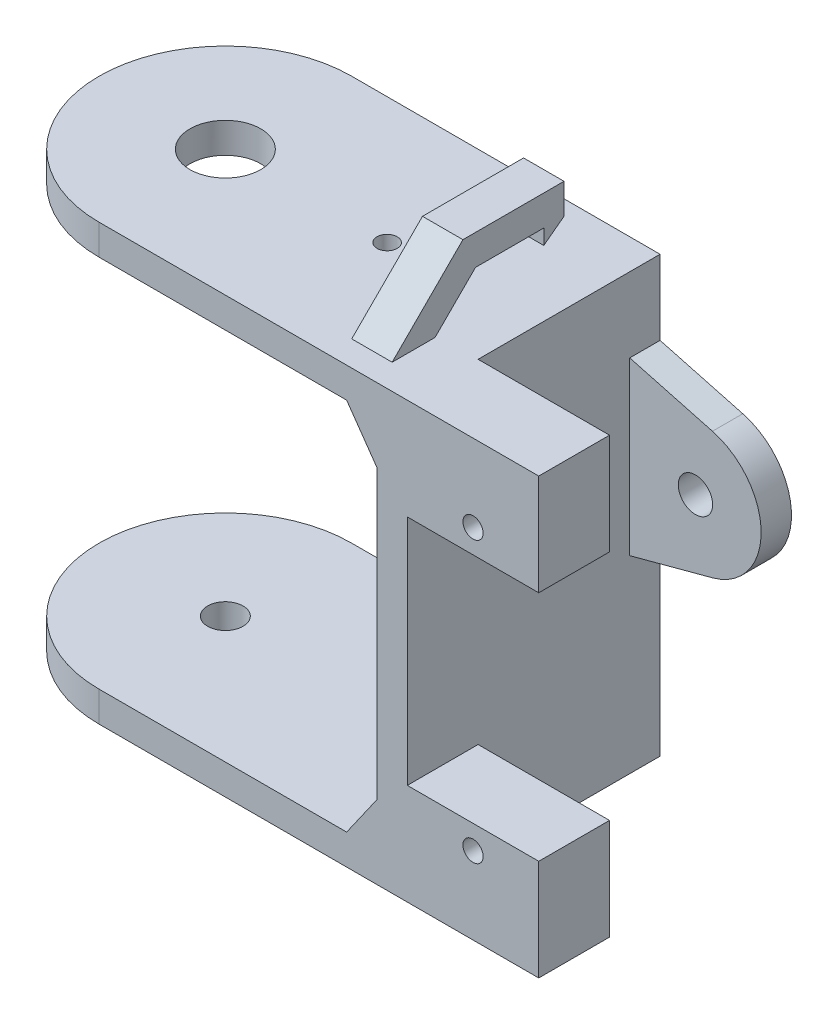
ISO-10303-21;
HEADER;
FILE_DESCRIPTION(('STEP AP214'),'2;1');
FILE_NAME('part.step','',(''),(''),'','','');
FILE_SCHEMA(('AUTOMOTIVE_DESIGN { 1 0 10303 214 1 1 1 1 }'));
ENDSEC;
DATA;
#1=APPLICATION_CONTEXT('core data for automotive mechanical design processes');
#2=APPLICATION_PROTOCOL_DEFINITION('international standard','automotive_design',2000,#1);
#3=PRODUCT_CONTEXT('',#1,'mechanical');
#4=PRODUCT('Part','Part','',(#3));
#5=PRODUCT_RELATED_PRODUCT_CATEGORY('part','',(#4));
#6=PRODUCT_DEFINITION_FORMATION('','',#4);
#7=PRODUCT_DEFINITION_CONTEXT('part definition',#1,'design');
#8=PRODUCT_DEFINITION('design','',#6,#7);
#9=PRODUCT_DEFINITION_SHAPE('','',#8);
#10=(LENGTH_UNIT() NAMED_UNIT(*) SI_UNIT(.MILLI.,.METRE.));
#11=(NAMED_UNIT(*) PLANE_ANGLE_UNIT() SI_UNIT($,.RADIAN.));
#12=(NAMED_UNIT(*) SI_UNIT($,.STERADIAN.) SOLID_ANGLE_UNIT());
#13=UNCERTAINTY_MEASURE_WITH_UNIT(LENGTH_MEASURE(1.E-05),#10,'distance_accuracy_value','');
#14=(GEOMETRIC_REPRESENTATION_CONTEXT(3) GLOBAL_UNCERTAINTY_ASSIGNED_CONTEXT((#13)) GLOBAL_UNIT_ASSIGNED_CONTEXT((#10,
#11,#12)) REPRESENTATION_CONTEXT('',''));
#15=CARTESIAN_POINT('',(0.,0.,0.));
#16=DIRECTION('',(0.,0.,1.));
#17=DIRECTION('',(1.,0.,0.));
#18=AXIS2_PLACEMENT_3D('',#15,#16,#17);
#19=CARTESIAN_POINT('',(-43.,21.5,12.5));
#20=DIRECTION('',(0.,-1.,0.));
#21=DIRECTION('',(1.,0.,0.));
#22=AXIS2_PLACEMENT_3D('',#19,#20,#21);
#23=PLANE('',#22);
#24=DIRECTION('',(0.,0.,-1.));
#25=VECTOR('',#24,1.);
#26=CARTESIAN_POINT('',(13.,21.5,12.5));
#27=LINE('',#26,#25);
#28=CARTESIAN_POINT('',(13.,21.5,12.5));
#29=VERTEX_POINT('',#28);
#30=CARTESIAN_POINT('',(13.,21.5,5.5));
#31=VERTEX_POINT('',#30);
#32=EDGE_CURVE('E418',#29,#31,#27,.T.);
#33=ORIENTED_EDGE('',*,*,#32,.T.);
#34=DIRECTION('',(1.,0.,0.));
#35=VECTOR('',#34,1.);
#36=CARTESIAN_POINT('',(13.,21.5,5.5));
#37=LINE('',#36,#35);
#38=CARTESIAN_POINT('',(0.,21.5,5.5));
#39=VERTEX_POINT('',#38);
#40=EDGE_CURVE('E345',#39,#31,#37,.T.);
#41=ORIENTED_EDGE('',*,*,#40,.F.);
#42=DIRECTION('',(0.,0.,1.));
#43=VECTOR('',#42,1.);
#44=CARTESIAN_POINT('',(0.,21.5,5.5));
#45=LINE('',#44,#43);
#46=CARTESIAN_POINT('',(0.,21.5,-12.5));
#47=VERTEX_POINT('',#46);
#48=EDGE_CURVE('E335',#47,#39,#45,.T.);
#49=ORIENTED_EDGE('',*,*,#48,.F.);
#50=DIRECTION('',(-1.,0.,0.));
#51=VECTOR('',#50,1.);
#52=CARTESIAN_POINT('',(-43.,21.5,-12.5));
#53=LINE('',#52,#51);
#54=CARTESIAN_POINT('',(-30.5,21.5,-12.5));
#55=VERTEX_POINT('',#54);
#56=EDGE_CURVE('E429',#47,#55,#53,.T.);
#57=ORIENTED_EDGE('',*,*,#56,.T.);
#58=CARTESIAN_POINT('',(-30.5,21.5,0.));
#59=DIRECTION('',(0.,-1.,0.));
#60=DIRECTION('',(0.,0.,1.));
#61=AXIS2_PLACEMENT_3D('',#58,#59,#60);
#62=CIRCLE('',#61,12.5);
#63=CARTESIAN_POINT('',(-30.5,21.5,12.5));
#64=VERTEX_POINT('',#63);
#65=EDGE_CURVE('E370',#64,#55,#62,.T.);
#66=ORIENTED_EDGE('',*,*,#65,.F.);
#67=DIRECTION('',(-1.,0.,0.));
#68=VECTOR('',#67,1.);
#69=CARTESIAN_POINT('',(0.,21.5,12.5));
#70=LINE('',#69,#68);
#71=EDGE_CURVE('E413',#29,#64,#70,.T.);
#72=ORIENTED_EDGE('',*,*,#71,.F.);
#73=EDGE_LOOP('',(#33,#41,#49,#57,#66,#72));
#74=FACE_BOUND('',#73,.T.);
#75=CARTESIAN_POINT('',(-30.5,21.5,0.));
#76=DIRECTION('',(0.,1.,0.));
#77=DIRECTION('',(0.,0.,1.));
#78=AXIS2_PLACEMENT_3D('',#75,#76,#77);
#79=CIRCLE('',#78,3.5);
#80=CARTESIAN_POINT('',(-30.5,21.5,3.5));
#81=VERTEX_POINT('',#80);
#82=EDGE_CURVE('E383',#81,#81,#79,.T.);
#83=ORIENTED_EDGE('',*,*,#82,.F.);
#84=EDGE_LOOP('',(#83));
#85=FACE_BOUND('',#84,.T.);
#86=CARTESIAN_POINT('',(-14.5,21.5,0.));
#87=DIRECTION('',(0.,1.,0.));
#88=DIRECTION('',(0.,0.,1.));
#89=AXIS2_PLACEMENT_3D('',#86,#87,#88);
#90=CIRCLE('',#89,0.999999999999998);
#91=CARTESIAN_POINT('',(-14.5,21.5,1.));
#92=VERTEX_POINT('',#91);
#93=EDGE_CURVE('E371',#92,#92,#90,.T.);
#94=ORIENTED_EDGE('',*,*,#93,.F.);
#95=EDGE_LOOP('',(#94));
#96=FACE_BOUND('',#95,.T.);
#97=DIRECTION('',(0.,0.,-1.));
#98=VECTOR('',#97,1.);
#99=CARTESIAN_POINT('',(-8.00000000000001,21.5,5.7573593128806));
#100=LINE('',#99,#98);
#101=CARTESIAN_POINT('',(-8.00000000000001,21.5,10.));
#102=VERTEX_POINT('',#101);
#103=CARTESIAN_POINT('',(-8.00000000000001,21.5,5.7573593128806));
#104=VERTEX_POINT('',#103);
#105=EDGE_CURVE('E240',#102,#104,#100,.T.);
#106=ORIENTED_EDGE('',*,*,#105,.T.);
#107=DIRECTION('',(1.,0.,0.));
#108=VECTOR('',#107,1.);
#109=CARTESIAN_POINT('',(-8.00000000000001,21.5,5.7573593128806));
#110=LINE('',#109,#108);
#111=CARTESIAN_POINT('',(-4.00000000000001,21.5,5.7573593128806));
#112=VERTEX_POINT('',#111);
#113=EDGE_CURVE('E224',#104,#112,#110,.T.);
#114=ORIENTED_EDGE('',*,*,#113,.T.);
#115=DIRECTION('',(0.,0.,-1.));
#116=VECTOR('',#115,1.);
#117=CARTESIAN_POINT('',(-4.00000000000001,21.5,5.7573593128806));
#118=LINE('',#117,#116);
#119=CARTESIAN_POINT('',(-4.00000000000001,21.5,10.));
#120=VERTEX_POINT('',#119);
#121=EDGE_CURVE('E266',#120,#112,#118,.T.);
#122=ORIENTED_EDGE('',*,*,#121,.F.);
#123=DIRECTION('',(1.,0.,0.));
#124=VECTOR('',#123,1.);
#125=CARTESIAN_POINT('',(-8.00000000000001,21.5,10.));
#126=LINE('',#125,#124);
#127=EDGE_CURVE('E247',#102,#120,#126,.T.);
#128=ORIENTED_EDGE('',*,*,#127,.F.);
#129=EDGE_LOOP('',(#106,#114,#122,#128));
#130=FACE_BOUND('',#129,.T.);
#131=ADVANCED_FACE('F35',(#74,#85,#96,#130),#23,.F.);
#132=CARTESIAN_POINT('',(-43.,-18.5,12.5));
#133=DIRECTION('',(0.,-1.,0.));
#134=DIRECTION('',(1.,0.,0.));
#135=AXIS2_PLACEMENT_3D('',#132,#133,#134);
#136=PLANE('',#135);
#137=CARTESIAN_POINT('',(-30.5,-18.5,0.));
#138=DIRECTION('',(0.,1.,0.));
#139=DIRECTION('',(0.,0.,1.));
#140=AXIS2_PLACEMENT_3D('',#137,#138,#139);
#141=CIRCLE('',#140,1.75);
#142=CARTESIAN_POINT('',(-30.5,-18.5,1.75000000000001));
#143=VERTEX_POINT('',#142);
#144=EDGE_CURVE('E303',#143,#143,#141,.T.);
#145=ORIENTED_EDGE('',*,*,#144,.F.);
#146=EDGE_LOOP('',(#145));
#147=FACE_BOUND('',#146,.T.);
#148=CARTESIAN_POINT('',(-30.5,-18.5,0.));
#149=DIRECTION('',(0.,-1.,0.));
#150=DIRECTION('',(1.,0.,0.));
#151=AXIS2_PLACEMENT_3D('',#148,#149,#150);
#152=CIRCLE('',#151,12.5);
#153=CARTESIAN_POINT('',(-30.5,-18.5,12.5));
#154=VERTEX_POINT('',#153);
#155=CARTESIAN_POINT('',(-30.5,-18.5,-12.5));
#156=VERTEX_POINT('',#155);
#157=EDGE_CURVE('E300',#154,#156,#152,.T.);
#158=ORIENTED_EDGE('',*,*,#157,.F.);
#159=DIRECTION('',(-1.,0.,0.));
#160=VECTOR('',#159,1.);
#161=CARTESIAN_POINT('',(-43.,-18.5,12.5));
#162=LINE('',#161,#160);
#163=CARTESIAN_POINT('',(-5.99999999999999,-18.5,12.5));
#164=VERTEX_POINT('',#163);
#165=EDGE_CURVE('E397',#164,#154,#162,.T.);
#166=ORIENTED_EDGE('',*,*,#165,.F.);
#167=DIRECTION('',(0.,0.,-1.));
#168=VECTOR('',#167,1.);
#169=CARTESIAN_POINT('',(-5.99999999999999,-18.5,-12.5));
#170=LINE('',#169,#168);
#171=CARTESIAN_POINT('',(-5.99999999999999,-18.5,-12.5));
#172=VERTEX_POINT('',#171);
#173=EDGE_CURVE('E453',#164,#172,#170,.T.);
#174=ORIENTED_EDGE('',*,*,#173,.T.);
#175=DIRECTION('',(-1.,0.,0.));
#176=VECTOR('',#175,1.);
#177=CARTESIAN_POINT('',(-43.,-18.5,-12.5));
#178=LINE('',#177,#176);
#179=EDGE_CURVE('E421',#172,#156,#178,.T.);
#180=ORIENTED_EDGE('',*,*,#179,.T.);
#181=EDGE_LOOP('',(#158,#166,#174,#180));
#182=FACE_BOUND('',#181,.T.);
#183=ADVANCED_FACE('F497',(#147,#182),#136,.F.);
#184=CARTESIAN_POINT('',(0.,-21.5,12.5));
#185=DIRECTION('',(0.,1.,0.));
#186=DIRECTION('',(0.,0.,1.));
#187=AXIS2_PLACEMENT_3D('',#184,#185,#186);
#188=PLANE('',#187);
#189=CARTESIAN_POINT('',(-30.5,-21.5,0.));
#190=DIRECTION('',(0.,1.,0.));
#191=DIRECTION('',(0.,0.,1.));
#192=AXIS2_PLACEMENT_3D('',#189,#190,#191);
#193=CIRCLE('',#192,1.75);
#194=CARTESIAN_POINT('',(-30.5,-21.5,1.75000000000001));
#195=VERTEX_POINT('',#194);
#196=EDGE_CURVE('E39',#195,#195,#193,.T.);
#197=ORIENTED_EDGE('',*,*,#196,.T.);
#198=EDGE_LOOP('',(#197));
#199=FACE_BOUND('',#198,.T.);
#200=CARTESIAN_POINT('',(-30.5,-21.5,0.));
#201=DIRECTION('',(0.,1.,0.));
#202=DIRECTION('',(0.,0.,1.));
#203=AXIS2_PLACEMENT_3D('',#200,#201,#202);
#204=CIRCLE('',#203,12.5);
#205=CARTESIAN_POINT('',(-30.5,-21.5,-12.5));
#206=VERTEX_POINT('',#205);
#207=CARTESIAN_POINT('',(-30.5,-21.5,12.5));
#208=VERTEX_POINT('',#207);
#209=EDGE_CURVE('E283',#206,#208,#204,.T.);
#210=ORIENTED_EDGE('',*,*,#209,.F.);
#211=DIRECTION('',(1.,0.,0.));
#212=VECTOR('',#211,1.);
#213=CARTESIAN_POINT('',(0.,-21.5,-12.5));
#214=LINE('',#213,#212);
#215=CARTESIAN_POINT('',(0.,-21.5,-12.5));
#216=VERTEX_POINT('',#215);
#217=EDGE_CURVE('E424',#206,#216,#214,.T.);
#218=ORIENTED_EDGE('',*,*,#217,.T.);
#219=DIRECTION('',(0.,0.,1.));
#220=VECTOR('',#219,1.);
#221=CARTESIAN_POINT('',(0.,-21.5,5.5));
#222=LINE('',#221,#220);
#223=CARTESIAN_POINT('',(0.,-21.5,5.5));
#224=VERTEX_POINT('',#223);
#225=EDGE_CURVE('E347',#216,#224,#222,.T.);
#226=ORIENTED_EDGE('',*,*,#225,.T.);
#227=DIRECTION('',(1.,0.,0.));
#228=VECTOR('',#227,1.);
#229=CARTESIAN_POINT('',(13.,-21.5,5.5));
#230=LINE('',#229,#228);
#231=CARTESIAN_POINT('',(13.,-21.5,5.5));
#232=VERTEX_POINT('',#231);
#233=EDGE_CURVE('E350',#224,#232,#230,.T.);
#234=ORIENTED_EDGE('',*,*,#233,.T.);
#235=DIRECTION('',(0.,0.,-1.));
#236=VECTOR('',#235,1.);
#237=CARTESIAN_POINT('',(13.,-21.5,12.5));
#238=LINE('',#237,#236);
#239=CARTESIAN_POINT('',(13.,-21.5,12.5));
#240=VERTEX_POINT('',#239);
#241=EDGE_CURVE('E446',#240,#232,#238,.T.);
#242=ORIENTED_EDGE('',*,*,#241,.F.);
#243=DIRECTION('',(1.,0.,0.));
#244=VECTOR('',#243,1.);
#245=CARTESIAN_POINT('',(0.,-21.5,12.5));
#246=LINE('',#245,#244);
#247=EDGE_CURVE('E401',#208,#240,#246,.T.);
#248=ORIENTED_EDGE('',*,*,#247,.F.);
#249=EDGE_LOOP('',(#210,#218,#226,#234,#242,#248));
#250=FACE_BOUND('',#249,.T.);
#251=ADVANCED_FACE('F505',(#199,#250),#188,.F.);
#252=CARTESIAN_POINT('',(0.,0.,12.5));
#253=DIRECTION('',(0.,0.,1.));
#254=DIRECTION('',(1.,0.,0.));
#255=AXIS2_PLACEMENT_3D('',#252,#253,#254);
#256=PLANE('',#255);
#257=DIRECTION('',(0.,1.,0.));
#258=VECTOR('',#257,1.);
#259=CARTESIAN_POINT('',(-30.5,-21.5,12.5));
#260=LINE('',#259,#258);
#261=EDGE_CURVE('E296',#208,#154,#260,.T.);
#262=ORIENTED_EDGE('',*,*,#261,.F.);
#263=ORIENTED_EDGE('',*,*,#247,.T.);
#264=DIRECTION('',(0.,1.,0.));
#265=VECTOR('',#264,1.);
#266=CARTESIAN_POINT('',(13.,-21.5,12.5));
#267=LINE('',#266,#265);
#268=CARTESIAN_POINT('',(13.,-11.5,12.5));
#269=VERTEX_POINT('',#268);
#270=EDGE_CURVE('E403',#240,#269,#267,.T.);
#271=ORIENTED_EDGE('',*,*,#270,.T.);
#272=DIRECTION('',(-1.,0.,0.));
#273=VECTOR('',#272,1.);
#274=CARTESIAN_POINT('',(13.,-11.5,12.5));
#275=LINE('',#274,#273);
#276=CARTESIAN_POINT('',(0.,-11.5,12.5));
#277=VERTEX_POINT('',#276);
#278=EDGE_CURVE('E405',#269,#277,#275,.T.);
#279=ORIENTED_EDGE('',*,*,#278,.T.);
#280=DIRECTION('',(0.,1.,0.));
#281=VECTOR('',#280,1.);
#282=CARTESIAN_POINT('',(0.,11.5,12.5));
#283=LINE('',#282,#281);
#284=CARTESIAN_POINT('',(0.,11.5,12.5));
#285=VERTEX_POINT('',#284);
#286=EDGE_CURVE('E407',#277,#285,#283,.T.);
#287=ORIENTED_EDGE('',*,*,#286,.T.);
#288=DIRECTION('',(1.,0.,0.));
#289=VECTOR('',#288,1.);
#290=CARTESIAN_POINT('',(13.,11.5,12.5));
#291=LINE('',#290,#289);
#292=CARTESIAN_POINT('',(13.,11.5,12.5));
#293=VERTEX_POINT('',#292);
#294=EDGE_CURVE('E409',#285,#293,#291,.T.);
#295=ORIENTED_EDGE('',*,*,#294,.T.);
#296=DIRECTION('',(0.,1.,0.));
#297=VECTOR('',#296,1.);
#298=CARTESIAN_POINT('',(13.,21.5,12.5));
#299=LINE('',#298,#297);
#300=EDGE_CURVE('E411',#293,#29,#299,.T.);
#301=ORIENTED_EDGE('',*,*,#300,.T.);
#302=ORIENTED_EDGE('',*,*,#71,.T.);
#303=DIRECTION('',(0.,1.,0.));
#304=VECTOR('',#303,1.);
#305=CARTESIAN_POINT('',(-30.5,6.5,12.5));
#306=LINE('',#305,#304);
#307=CARTESIAN_POINT('',(-30.5,18.5,12.5));
#308=VERTEX_POINT('',#307);
#309=EDGE_CURVE('E375',#308,#64,#306,.T.);
#310=ORIENTED_EDGE('',*,*,#309,.F.);
#311=DIRECTION('',(1.,0.,0.));
#312=VECTOR('',#311,1.);
#313=CARTESIAN_POINT('',(-2.99999999999999,18.5,12.5));
#314=LINE('',#313,#312);
#315=CARTESIAN_POINT('',(-5.99999999999999,18.5,12.5));
#316=VERTEX_POINT('',#315);
#317=EDGE_CURVE('E416',#308,#316,#314,.T.);
#318=ORIENTED_EDGE('',*,*,#317,.T.);
#319=DIRECTION('',(-0.573576436351042,0.819152044288994,0.));
#320=VECTOR('',#319,1.);
#321=CARTESIAN_POINT('',(-2.99999999999999,14.2155559797736,12.5));
#322=LINE('',#321,#320);
#323=CARTESIAN_POINT('',(-2.99999999999999,14.2155559797736,12.5));
#324=VERTEX_POINT('',#323);
#325=EDGE_CURVE('E11',#316,#324,#322,.F.);
#326=ORIENTED_EDGE('',*,*,#325,.T.);
#327=DIRECTION('',(0.,-1.,0.));
#328=VECTOR('',#327,1.);
#329=CARTESIAN_POINT('',(-2.99999999999999,-18.5,12.5));
#330=LINE('',#329,#328);
#331=CARTESIAN_POINT('',(-2.99999999999999,-14.2155559797736,12.5));
#332=VERTEX_POINT('',#331);
#333=EDGE_CURVE('E394',#324,#332,#330,.T.);
#334=ORIENTED_EDGE('',*,*,#333,.T.);
#335=DIRECTION('',(0.573576436351042,0.819152044288994,0.));
#336=VECTOR('',#335,1.);
#337=CARTESIAN_POINT('',(-5.99999999999999,-18.5,12.5));
#338=LINE('',#337,#336);
#339=EDGE_CURVE('E468',#332,#164,#338,.F.);
#340=ORIENTED_EDGE('',*,*,#339,.T.);
#341=ORIENTED_EDGE('',*,*,#165,.T.);
#342=EDGE_LOOP('',(#262,#263,#271,#279,#287,#295,#301,#302,#310,#318,#326,#334,#340,#341));
#343=FACE_BOUND('',#342,.T.);
#344=CARTESIAN_POINT('',(6.5,13.85,12.5));
#345=DIRECTION('',(0.,0.,1.));
#346=DIRECTION('',(1.,0.,0.));
#347=AXIS2_PLACEMENT_3D('',#344,#345,#346);
#348=CIRCLE('',#347,1.);
#349=CARTESIAN_POINT('',(7.5,13.85,12.5));
#350=VERTEX_POINT('',#349);
#351=EDGE_CURVE('E390',#350,#350,#348,.T.);
#352=ORIENTED_EDGE('',*,*,#351,.F.);
#353=EDGE_LOOP('',(#352));
#354=FACE_BOUND('',#353,.T.);
#355=CARTESIAN_POINT('',(6.5,-13.85,12.5));
#356=DIRECTION('',(0.,0.,1.));
#357=DIRECTION('',(-1.,0.,0.));
#358=AXIS2_PLACEMENT_3D('',#355,#356,#357);
#359=CIRCLE('',#358,1.);
#360=CARTESIAN_POINT('',(5.49999999999999,-13.85,12.5));
#361=VERTEX_POINT('',#360);
#362=EDGE_CURVE('E387',#361,#361,#359,.T.);
#363=ORIENTED_EDGE('',*,*,#362,.F.);
#364=EDGE_LOOP('',(#363));
#365=FACE_BOUND('',#364,.T.);
#366=ADVANCED_FACE('F484',(#343,#354,#365),#256,.T.);
#367=CARTESIAN_POINT('',(0.,0.,-12.5));
#368=DIRECTION('',(0.,0.,1.));
#369=DIRECTION('',(1.,0.,0.));
#370=AXIS2_PLACEMENT_3D('',#367,#368,#369);
#371=PLANE('',#370);
#372=ORIENTED_EDGE('',*,*,#217,.F.);
#373=DIRECTION('',(0.,1.,0.));
#374=VECTOR('',#373,1.);
#375=CARTESIAN_POINT('',(-30.5,-21.5,-12.5));
#376=LINE('',#375,#374);
#377=EDGE_CURVE('E297',#206,#156,#376,.T.);
#378=ORIENTED_EDGE('',*,*,#377,.T.);
#379=ORIENTED_EDGE('',*,*,#179,.F.);
#380=DIRECTION('',(-0.573576436351042,-0.819152044288994,0.));
#381=VECTOR('',#380,1.);
#382=CARTESIAN_POINT('',(4.6660963122926,-3.26723581187977,-12.5));
#383=LINE('',#382,#381);
#384=CARTESIAN_POINT('',(-2.99999999999999,-14.2155559797736,-12.5));
#385=VERTEX_POINT('',#384);
#386=EDGE_CURVE('E466',#172,#385,#383,.F.);
#387=ORIENTED_EDGE('',*,*,#386,.T.);
#388=DIRECTION('',(0.,-1.,0.));
#389=VECTOR('',#388,1.);
#390=CARTESIAN_POINT('',(-2.99999999999999,-18.5,-12.5));
#391=LINE('',#390,#389);
#392=CARTESIAN_POINT('',(-2.99999999999999,14.2155559797736,-12.5));
#393=VERTEX_POINT('',#392);
#394=EDGE_CURVE('E393',#393,#385,#391,.T.);
#395=ORIENTED_EDGE('',*,*,#394,.F.);
#396=DIRECTION('',(0.573576436351042,-0.819152044288994,0.));
#397=VECTOR('',#396,1.);
#398=CARTESIAN_POINT('',(4.6660963122926,3.26723581187977,-12.5));
#399=LINE('',#398,#397);
#400=CARTESIAN_POINT('',(-5.99999999999999,18.5,-12.5));
#401=VERTEX_POINT('',#400);
#402=EDGE_CURVE('E44',#393,#401,#399,.F.);
#403=ORIENTED_EDGE('',*,*,#402,.T.);
#404=DIRECTION('',(1.,0.,0.));
#405=VECTOR('',#404,1.);
#406=CARTESIAN_POINT('',(-2.99999999999999,18.5,-12.5));
#407=LINE('',#406,#405);
#408=CARTESIAN_POINT('',(-30.5,18.5,-12.5));
#409=VERTEX_POINT('',#408);
#410=EDGE_CURVE('E398',#409,#401,#407,.T.);
#411=ORIENTED_EDGE('',*,*,#410,.F.);
#412=DIRECTION('',(0.,1.,0.));
#413=VECTOR('',#412,1.);
#414=CARTESIAN_POINT('',(-30.5,6.5,-12.5));
#415=LINE('',#414,#413);
#416=EDGE_CURVE('E378',#409,#55,#415,.T.);
#417=ORIENTED_EDGE('',*,*,#416,.T.);
#418=ORIENTED_EDGE('',*,*,#56,.F.);
#419=DIRECTION('',(0.,1.,0.));
#420=VECTOR('',#419,1.);
#421=CARTESIAN_POINT('',(0.,11.5,-12.5));
#422=LINE('',#421,#420);
#423=CARTESIAN_POINT('',(0.,14.1209649234678,-12.5));
#424=VERTEX_POINT('',#423);
#425=EDGE_CURVE('E426',#424,#47,#422,.T.);
#426=ORIENTED_EDGE('',*,*,#425,.F.);
#427=DIRECTION('',(0.965925826289069,-0.258819045102519,0.));
#428=VECTOR('',#427,1.);
#429=CARTESIAN_POINT('',(8.18232379316637,11.928517870879,-12.5));
#430=LINE('',#429,#428);
#431=CARTESIAN_POINT('',(8.18232379316637,11.928517870879,-12.5));
#432=VERTEX_POINT('',#431);
#433=EDGE_CURVE('E317',#424,#432,#430,.T.);
#434=ORIENTED_EDGE('',*,*,#433,.T.);
#435=CARTESIAN_POINT('',(6.5,5.65,-12.5));
#436=DIRECTION('',(0.,0.,-1.));
#437=DIRECTION('',(-1.,0.,0.));
#438=AXIS2_PLACEMENT_3D('',#435,#436,#437);
#439=CIRCLE('',#438,6.5);
#440=CARTESIAN_POINT('',(8.18232379316637,-0.628517870878954,-12.5));
#441=VERTEX_POINT('',#440);
#442=EDGE_CURVE('E309',#432,#441,#439,.T.);
#443=ORIENTED_EDGE('',*,*,#442,.T.);
#444=DIRECTION('',(-0.965925826289069,-0.258819045102518,0.));
#445=VECTOR('',#444,1.);
#446=CARTESIAN_POINT('',(8.18232379316637,-0.628517870878954,-12.5));
#447=LINE('',#446,#445);
#448=CARTESIAN_POINT('',(0.,-2.82096492346781,-12.5));
#449=VERTEX_POINT('',#448);
#450=EDGE_CURVE('E328',#441,#449,#447,.T.);
#451=ORIENTED_EDGE('',*,*,#450,.T.);
#452=EDGE_CURVE('E427',#216,#449,#422,.T.);
#453=ORIENTED_EDGE('',*,*,#452,.F.);
#454=EDGE_LOOP('',(#372,#378,#379,#387,#395,#403,#411,#417,#418,#426,#434,#443,#451,#453));
#455=FACE_BOUND('',#454,.T.);
#456=CARTESIAN_POINT('',(6.5,5.65,-12.5));
#457=DIRECTION('',(0.,0.,-1.));
#458=DIRECTION('',(-1.,0.,0.));
#459=AXIS2_PLACEMENT_3D('',#456,#457,#458);
#460=CIRCLE('',#459,1.7);
#461=CARTESIAN_POINT('',(4.8,5.65,-12.5));
#462=VERTEX_POINT('',#461);
#463=EDGE_CURVE('E310',#462,#462,#460,.T.);
#464=ORIENTED_EDGE('',*,*,#463,.F.);
#465=EDGE_LOOP('',(#464));
#466=FACE_BOUND('',#465,.T.);
#467=ADVANCED_FACE('F474',(#455,#466),#371,.F.);
#468=CARTESIAN_POINT('',(-2.99999999999999,-18.5,12.5));
#469=DIRECTION('',(1.,0.,0.));
#470=DIRECTION('',(0.,0.,-1.));
#471=AXIS2_PLACEMENT_3D('',#468,#469,#470);
#472=PLANE('',#471);
#473=ORIENTED_EDGE('',*,*,#394,.T.);
#474=DIRECTION('',(0.,0.,1.));
#475=VECTOR('',#474,1.);
#476=CARTESIAN_POINT('',(-2.99999999999999,-14.2155559797736,12.5));
#477=LINE('',#476,#475);
#478=EDGE_CURVE('E463',#385,#332,#477,.T.);
#479=ORIENTED_EDGE('',*,*,#478,.T.);
#480=ORIENTED_EDGE('',*,*,#333,.F.);
#481=DIRECTION('',(0.,0.,-1.));
#482=VECTOR('',#481,1.);
#483=CARTESIAN_POINT('',(-2.99999999999999,14.2155559797736,-12.5));
#484=LINE('',#483,#482);
#485=EDGE_CURVE('E460',#324,#393,#484,.T.);
#486=ORIENTED_EDGE('',*,*,#485,.T.);
#487=EDGE_LOOP('',(#473,#479,#480,#486));
#488=FACE_BOUND('',#487,.T.);
#489=ADVANCED_FACE('F489',(#488),#472,.F.);
#490=CARTESIAN_POINT('',(13.,-21.5,12.5));
#491=DIRECTION('',(-1.,0.,0.));
#492=DIRECTION('',(0.,-1.,0.));
#493=AXIS2_PLACEMENT_3D('',#490,#491,#492);
#494=PLANE('',#493);
#495=ORIENTED_EDGE('',*,*,#241,.T.);
#496=DIRECTION('',(0.,1.,0.));
#497=VECTOR('',#496,1.);
#498=CARTESIAN_POINT('',(13.,-21.5,5.5));
#499=LINE('',#498,#497);
#500=CARTESIAN_POINT('',(13.,-11.5,5.5));
#501=VERTEX_POINT('',#500);
#502=EDGE_CURVE('E354',#232,#501,#499,.T.);
#503=ORIENTED_EDGE('',*,*,#502,.T.);
#504=DIRECTION('',(0.,0.,-1.));
#505=VECTOR('',#504,1.);
#506=CARTESIAN_POINT('',(13.,-11.5,12.5));
#507=LINE('',#506,#505);
#508=EDGE_CURVE('E443',#269,#501,#507,.T.);
#509=ORIENTED_EDGE('',*,*,#508,.F.);
#510=ORIENTED_EDGE('',*,*,#270,.F.);
#511=EDGE_LOOP('',(#495,#503,#509,#510));
#512=FACE_BOUND('',#511,.T.);
#513=ADVANCED_FACE('F512',(#512),#494,.F.);
#514=CARTESIAN_POINT('',(13.,-11.5,12.5));
#515=DIRECTION('',(0.,-1.,0.));
#516=DIRECTION('',(1.,0.,0.));
#517=AXIS2_PLACEMENT_3D('',#514,#515,#516);
#518=PLANE('',#517);
#519=ORIENTED_EDGE('',*,*,#508,.T.);
#520=DIRECTION('',(-1.,0.,0.));
#521=VECTOR('',#520,1.);
#522=CARTESIAN_POINT('',(13.,-11.5,5.5));
#523=LINE('',#522,#521);
#524=CARTESIAN_POINT('',(0.,-11.5,5.5));
#525=VERTEX_POINT('',#524);
#526=EDGE_CURVE('E367',#501,#525,#523,.T.);
#527=ORIENTED_EDGE('',*,*,#526,.T.);
#528=DIRECTION('',(0.,0.,-1.));
#529=VECTOR('',#528,1.);
#530=CARTESIAN_POINT('',(0.,-11.5,12.5));
#531=LINE('',#530,#529);
#532=EDGE_CURVE('E440',#277,#525,#531,.T.);
#533=ORIENTED_EDGE('',*,*,#532,.F.);
#534=ORIENTED_EDGE('',*,*,#278,.F.);
#535=EDGE_LOOP('',(#519,#527,#533,#534));
#536=FACE_BOUND('',#535,.T.);
#537=ADVANCED_FACE('F516',(#536),#518,.F.);
#538=CARTESIAN_POINT('',(0.,11.5,12.5));
#539=DIRECTION('',(-1.,0.,0.));
#540=DIRECTION('',(0.,-1.,0.));
#541=AXIS2_PLACEMENT_3D('',#538,#539,#540);
#542=PLANE('',#541);
#543=DIRECTION('',(0.,1.,0.));
#544=VECTOR('',#543,1.);
#545=CARTESIAN_POINT('',(0.,14.1209649234678,-9.5));
#546=LINE('',#545,#544);
#547=CARTESIAN_POINT('',(0.,-2.82096492346781,-9.5));
#548=VERTEX_POINT('',#547);
#549=CARTESIAN_POINT('',(0.,14.1209649234678,-9.5));
#550=VERTEX_POINT('',#549);
#551=EDGE_CURVE('E320',#548,#550,#546,.T.);
#552=ORIENTED_EDGE('',*,*,#551,.T.);
#553=DIRECTION('',(0.,0.,-1.));
#554=VECTOR('',#553,1.);
#555=CARTESIAN_POINT('',(0.,14.1209649234678,-9.5));
#556=LINE('',#555,#554);
#557=EDGE_CURVE('E336',#550,#424,#556,.T.);
#558=ORIENTED_EDGE('',*,*,#557,.T.);
#559=ORIENTED_EDGE('',*,*,#425,.T.);
#560=ORIENTED_EDGE('',*,*,#48,.T.);
#561=DIRECTION('',(0.,1.,0.));
#562=VECTOR('',#561,1.);
#563=CARTESIAN_POINT('',(0.,-21.5,5.5));
#564=LINE('',#563,#562);
#565=CARTESIAN_POINT('',(0.,11.5,5.5));
#566=VERTEX_POINT('',#565);
#567=EDGE_CURVE('E353',#566,#39,#564,.T.);
#568=ORIENTED_EDGE('',*,*,#567,.F.);
#569=DIRECTION('',(0.,0.,-1.));
#570=VECTOR('',#569,1.);
#571=CARTESIAN_POINT('',(0.,11.5,12.5));
#572=LINE('',#571,#570);
#573=EDGE_CURVE('E437',#285,#566,#572,.T.);
#574=ORIENTED_EDGE('',*,*,#573,.F.);
#575=ORIENTED_EDGE('',*,*,#286,.F.);
#576=ORIENTED_EDGE('',*,*,#532,.T.);
#577=EDGE_CURVE('E359',#224,#525,#564,.T.);
#578=ORIENTED_EDGE('',*,*,#577,.F.);
#579=ORIENTED_EDGE('',*,*,#225,.F.);
#580=ORIENTED_EDGE('',*,*,#452,.T.);
#581=DIRECTION('',(0.,0.,-1.));
#582=VECTOR('',#581,1.);
#583=CARTESIAN_POINT('',(0.,-2.82096492346781,-9.5));
#584=LINE('',#583,#582);
#585=EDGE_CURVE('E339',#548,#449,#584,.T.);
#586=ORIENTED_EDGE('',*,*,#585,.F.);
#587=EDGE_LOOP('',(#552,#558,#559,#560,#568,#574,#575,#576,#578,#579,#580,#586));
#588=FACE_BOUND('',#587,.T.);
#589=ADVANCED_FACE('F523',(#588),#542,.F.);
#590=CARTESIAN_POINT('',(13.,11.5,12.5));
#591=DIRECTION('',(0.,1.,0.));
#592=DIRECTION('',(-1.,0.,0.));
#593=AXIS2_PLACEMENT_3D('',#590,#591,#592);
#594=PLANE('',#593);
#595=ORIENTED_EDGE('',*,*,#573,.T.);
#596=DIRECTION('',(1.,0.,0.));
#597=VECTOR('',#596,1.);
#598=CARTESIAN_POINT('',(13.,11.5,5.5));
#599=LINE('',#598,#597);
#600=CARTESIAN_POINT('',(13.,11.5,5.5));
#601=VERTEX_POINT('',#600);
#602=EDGE_CURVE('E364',#566,#601,#599,.T.);
#603=ORIENTED_EDGE('',*,*,#602,.T.);
#604=DIRECTION('',(0.,0.,-1.));
#605=VECTOR('',#604,1.);
#606=CARTESIAN_POINT('',(13.,11.5,12.5));
#607=LINE('',#606,#605);
#608=EDGE_CURVE('E434',#293,#601,#607,.T.);
#609=ORIENTED_EDGE('',*,*,#608,.F.);
#610=ORIENTED_EDGE('',*,*,#294,.F.);
#611=EDGE_LOOP('',(#595,#603,#609,#610));
#612=FACE_BOUND('',#611,.T.);
#613=ADVANCED_FACE('F525',(#612),#594,.F.);
#614=CARTESIAN_POINT('',(13.,21.5,12.5));
#615=DIRECTION('',(-1.,0.,0.));
#616=DIRECTION('',(0.,-1.,0.));
#617=AXIS2_PLACEMENT_3D('',#614,#615,#616);
#618=PLANE('',#617);
#619=ORIENTED_EDGE('',*,*,#608,.T.);
#620=EDGE_CURVE('E358',#601,#31,#499,.T.);
#621=ORIENTED_EDGE('',*,*,#620,.T.);
#622=ORIENTED_EDGE('',*,*,#32,.F.);
#623=ORIENTED_EDGE('',*,*,#300,.F.);
#624=EDGE_LOOP('',(#619,#621,#622,#623));
#625=FACE_BOUND('',#624,.T.);
#626=ADVANCED_FACE('F530',(#625),#618,.F.);
#627=CARTESIAN_POINT('',(-2.99999999999999,18.5,12.5));
#628=DIRECTION('',(0.,1.,0.));
#629=DIRECTION('',(-1.,0.,0.));
#630=AXIS2_PLACEMENT_3D('',#627,#628,#629);
#631=PLANE('',#630);
#632=CARTESIAN_POINT('',(-14.5,18.5,0.));
#633=DIRECTION('',(0.,1.,0.));
#634=DIRECTION('',(-1.,0.,0.));
#635=AXIS2_PLACEMENT_3D('',#632,#633,#634);
#636=CIRCLE('',#635,0.999999999999998);
#637=CARTESIAN_POINT('',(-15.5,18.5,0.));
#638=VERTEX_POINT('',#637);
#639=EDGE_CURVE('E374',#638,#638,#636,.T.);
#640=ORIENTED_EDGE('',*,*,#639,.T.);
#641=EDGE_LOOP('',(#640));
#642=FACE_BOUND('',#641,.T.);
#643=CARTESIAN_POINT('',(-30.5,18.5,0.));
#644=DIRECTION('',(0.,1.,0.));
#645=DIRECTION('',(-1.,0.,0.));
#646=AXIS2_PLACEMENT_3D('',#643,#644,#645);
#647=CIRCLE('',#646,3.5);
#648=CARTESIAN_POINT('',(-34.,18.5,0.));
#649=VERTEX_POINT('',#648);
#650=EDGE_CURVE('E386',#649,#649,#647,.T.);
#651=ORIENTED_EDGE('',*,*,#650,.T.);
#652=EDGE_LOOP('',(#651));
#653=FACE_BOUND('',#652,.T.);
#654=ORIENTED_EDGE('',*,*,#410,.T.);
#655=DIRECTION('',(0.,0.,1.));
#656=VECTOR('',#655,1.);
#657=CARTESIAN_POINT('',(-5.99999999999999,18.5,12.5));
#658=LINE('',#657,#656);
#659=EDGE_CURVE('E59',#401,#316,#658,.T.);
#660=ORIENTED_EDGE('',*,*,#659,.T.);
#661=ORIENTED_EDGE('',*,*,#317,.F.);
#662=CARTESIAN_POINT('',(-30.5,18.5,0.));
#663=DIRECTION('',(0.,1.,0.));
#664=DIRECTION('',(-1.,0.,0.));
#665=AXIS2_PLACEMENT_3D('',#662,#663,#664);
#666=CIRCLE('',#665,12.5);
#667=EDGE_CURVE('E449',#308,#409,#666,.F.);
#668=ORIENTED_EDGE('',*,*,#667,.T.);
#669=EDGE_LOOP('',(#654,#660,#661,#668));
#670=FACE_BOUND('',#669,.T.);
#671=ADVANCED_FACE('F478',(#642,#653,#670),#631,.F.);
#672=CARTESIAN_POINT('',(6.5,13.85,12.5));
#673=DIRECTION('',(0.,0.,-1.));
#674=DIRECTION('',(-1.,0.,0.));
#675=AXIS2_PLACEMENT_3D('',#672,#673,#674);
#676=CYLINDRICAL_SURFACE('',#675,1.);
#677=CARTESIAN_POINT('',(6.5,13.85,5.5));
#678=DIRECTION('',(0.,0.,1.));
#679=DIRECTION('',(1.,0.,0.));
#680=AXIS2_PLACEMENT_3D('',#677,#678,#679);
#681=CIRCLE('',#680,1.);
#682=CARTESIAN_POINT('',(7.5,13.85,5.5));
#683=VERTEX_POINT('',#682);
#684=EDGE_CURVE('E361',#683,#683,#681,.T.);
#685=ORIENTED_EDGE('',*,*,#684,.F.);
#686=EDGE_LOOP('',(#685));
#687=FACE_BOUND('',#686,.T.);
#688=ORIENTED_EDGE('',*,*,#351,.T.);
#689=EDGE_LOOP('',(#688));
#690=FACE_BOUND('',#689,.T.);
#691=ADVANCED_FACE('F748',(#687,#690),#676,.F.);
#692=CARTESIAN_POINT('',(6.5,-13.85,12.5));
#693=DIRECTION('',(0.,0.,-1.));
#694=DIRECTION('',(-1.,0.,0.));
#695=AXIS2_PLACEMENT_3D('',#692,#693,#694);
#696=CYLINDRICAL_SURFACE('',#695,1.);
#697=CARTESIAN_POINT('',(6.5,-13.85,5.5));
#698=DIRECTION('',(0.,0.,1.));
#699=DIRECTION('',(1.,0.,0.));
#700=AXIS2_PLACEMENT_3D('',#697,#698,#699);
#701=CIRCLE('',#700,1.);
#702=CARTESIAN_POINT('',(7.5,-13.85,5.5));
#703=VERTEX_POINT('',#702);
#704=EDGE_CURVE('E357',#703,#703,#701,.T.);
#705=ORIENTED_EDGE('',*,*,#704,.F.);
#706=EDGE_LOOP('',(#705));
#707=FACE_BOUND('',#706,.T.);
#708=ORIENTED_EDGE('',*,*,#362,.T.);
#709=EDGE_LOOP('',(#708));
#710=FACE_BOUND('',#709,.T.);
#711=ADVANCED_FACE('F820',(#707,#710),#696,.F.);
#712=CARTESIAN_POINT('',(-30.5,6.5,0.));
#713=DIRECTION('',(0.,1.,0.));
#714=DIRECTION('',(0.,0.,1.));
#715=AXIS2_PLACEMENT_3D('',#712,#713,#714);
#716=CYLINDRICAL_SURFACE('',#715,3.5);
#717=ORIENTED_EDGE('',*,*,#82,.T.);
#718=EDGE_LOOP('',(#717));
#719=FACE_BOUND('',#718,.T.);
#720=ORIENTED_EDGE('',*,*,#650,.F.);
#721=EDGE_LOOP('',(#720));
#722=FACE_BOUND('',#721,.T.);
#723=ADVANCED_FACE('F825',(#719,#722),#716,.F.);
#724=CARTESIAN_POINT('',(-30.5,6.5,0.));
#725=DIRECTION('',(0.,1.,0.));
#726=DIRECTION('',(0.,0.,1.));
#727=AXIS2_PLACEMENT_3D('',#724,#725,#726);
#728=CYLINDRICAL_SURFACE('',#727,12.5);
#729=ORIENTED_EDGE('',*,*,#65,.T.);
#730=ORIENTED_EDGE('',*,*,#416,.F.);
#731=ORIENTED_EDGE('',*,*,#667,.F.);
#732=ORIENTED_EDGE('',*,*,#309,.T.);
#733=EDGE_LOOP('',(#729,#730,#731,#732));
#734=FACE_BOUND('',#733,.T.);
#735=ADVANCED_FACE('F538',(#734),#728,.T.);
#736=CARTESIAN_POINT('',(-14.5,6.5,0.));
#737=DIRECTION('',(0.,1.,0.));
#738=DIRECTION('',(0.,0.,1.));
#739=AXIS2_PLACEMENT_3D('',#736,#737,#738);
#740=CYLINDRICAL_SURFACE('',#739,0.999999999999998);
#741=ORIENTED_EDGE('',*,*,#93,.T.);
#742=EDGE_LOOP('',(#741));
#743=FACE_BOUND('',#742,.T.);
#744=ORIENTED_EDGE('',*,*,#639,.F.);
#745=EDGE_LOOP('',(#744));
#746=FACE_BOUND('',#745,.T.);
#747=ADVANCED_FACE('F814',(#743,#746),#740,.F.);
#748=CARTESIAN_POINT('',(13.,-21.5,5.5));
#749=DIRECTION('',(0.,0.,1.));
#750=DIRECTION('',(1.,0.,0.));
#751=AXIS2_PLACEMENT_3D('',#748,#749,#750);
#752=PLANE('',#751);
#753=ORIENTED_EDGE('',*,*,#704,.T.);
#754=EDGE_LOOP('',(#753));
#755=FACE_BOUND('',#754,.T.);
#756=ORIENTED_EDGE('',*,*,#502,.F.);
#757=ORIENTED_EDGE('',*,*,#233,.F.);
#758=ORIENTED_EDGE('',*,*,#577,.T.);
#759=ORIENTED_EDGE('',*,*,#526,.F.);
#760=EDGE_LOOP('',(#756,#757,#758,#759));
#761=FACE_BOUND('',#760,.T.);
#762=ADVANCED_FACE('F805',(#755,#761),#752,.F.);
#763=ORIENTED_EDGE('',*,*,#684,.T.);
#764=EDGE_LOOP('',(#763));
#765=FACE_BOUND('',#764,.T.);
#766=ORIENTED_EDGE('',*,*,#567,.T.);
#767=ORIENTED_EDGE('',*,*,#40,.T.);
#768=ORIENTED_EDGE('',*,*,#620,.F.);
#769=ORIENTED_EDGE('',*,*,#602,.F.);
#770=EDGE_LOOP('',(#766,#767,#768,#769));
#771=FACE_BOUND('',#770,.T.);
#772=ADVANCED_FACE('F788',(#765,#771),#752,.F.);
#773=CARTESIAN_POINT('',(6.5,5.65,-9.5));
#774=DIRECTION('',(0.,0.,-1.));
#775=DIRECTION('',(-1.,0.,0.));
#776=AXIS2_PLACEMENT_3D('',#773,#774,#775);
#777=CYLINDRICAL_SURFACE('',#776,6.5);
#778=ORIENTED_EDGE('',*,*,#442,.F.);
#779=DIRECTION('',(0.,0.,-1.));
#780=VECTOR('',#779,1.);
#781=CARTESIAN_POINT('',(8.18232379316637,11.928517870879,-9.5));
#782=LINE('',#781,#780);
#783=CARTESIAN_POINT('',(8.18232379316637,11.928517870879,-9.5));
#784=VERTEX_POINT('',#783);
#785=EDGE_CURVE('E333',#784,#432,#782,.T.);
#786=ORIENTED_EDGE('',*,*,#785,.F.);
#787=CARTESIAN_POINT('',(6.5,5.65,-9.5));
#788=DIRECTION('',(0.,0.,-1.));
#789=DIRECTION('',(-1.,0.,0.));
#790=AXIS2_PLACEMENT_3D('',#787,#788,#789);
#791=CIRCLE('',#790,6.5);
#792=CARTESIAN_POINT('',(8.18232379316637,-0.628517870878954,-9.5));
#793=VERTEX_POINT('',#792);
#794=EDGE_CURVE('E313',#784,#793,#791,.T.);
#795=ORIENTED_EDGE('',*,*,#794,.T.);
#796=DIRECTION('',(0.,0.,-1.));
#797=VECTOR('',#796,1.);
#798=CARTESIAN_POINT('',(8.18232379316637,-0.628517870878954,-9.5));
#799=LINE('',#798,#797);
#800=EDGE_CURVE('E325',#793,#441,#799,.T.);
#801=ORIENTED_EDGE('',*,*,#800,.T.);
#802=EDGE_LOOP('',(#778,#786,#795,#801));
#803=FACE_BOUND('',#802,.T.);
#804=ADVANCED_FACE('F548',(#803),#777,.T.);
#805=CARTESIAN_POINT('',(8.18232379316637,11.928517870879,-9.5));
#806=DIRECTION('',(0.258819045102519,0.965925826289069,0.));
#807=DIRECTION('',(-0.965925826289069,0.258819045102519,0.));
#808=AXIS2_PLACEMENT_3D('',#805,#806,#807);
#809=PLANE('',#808);
#810=ORIENTED_EDGE('',*,*,#433,.F.);
#811=ORIENTED_EDGE('',*,*,#557,.F.);
#812=DIRECTION('',(0.965925826289069,-0.258819045102519,0.));
#813=VECTOR('',#812,1.);
#814=CARTESIAN_POINT('',(8.18232379316637,11.928517870879,-9.5));
#815=LINE('',#814,#813);
#816=EDGE_CURVE('E322',#550,#784,#815,.T.);
#817=ORIENTED_EDGE('',*,*,#816,.T.);
#818=ORIENTED_EDGE('',*,*,#785,.T.);
#819=EDGE_LOOP('',(#810,#811,#817,#818));
#820=FACE_BOUND('',#819,.T.);
#821=ADVANCED_FACE('F544',(#820),#809,.T.);
#822=CARTESIAN_POINT('',(8.18232379316637,-0.628517870878954,-9.5));
#823=DIRECTION('',(0.258819045102518,-0.965925826289069,0.));
#824=DIRECTION('',(0.965925826289069,0.258819045102518,0.));
#825=AXIS2_PLACEMENT_3D('',#822,#823,#824);
#826=PLANE('',#825);
#827=ORIENTED_EDGE('',*,*,#450,.F.);
#828=ORIENTED_EDGE('',*,*,#800,.F.);
#829=DIRECTION('',(-0.965925826289069,-0.258819045102518,0.));
#830=VECTOR('',#829,1.);
#831=CARTESIAN_POINT('',(8.18232379316637,-0.628517870878954,-9.5));
#832=LINE('',#831,#830);
#833=EDGE_CURVE('E316',#793,#548,#832,.T.);
#834=ORIENTED_EDGE('',*,*,#833,.T.);
#835=ORIENTED_EDGE('',*,*,#585,.T.);
#836=EDGE_LOOP('',(#827,#828,#834,#835));
#837=FACE_BOUND('',#836,.T.);
#838=ADVANCED_FACE('F551',(#837),#826,.T.);
#839=CARTESIAN_POINT('',(6.5,5.65,-9.5));
#840=DIRECTION('',(0.,0.,-1.));
#841=DIRECTION('',(-1.,0.,0.));
#842=AXIS2_PLACEMENT_3D('',#839,#840,#841);
#843=PLANE('',#842);
#844=CARTESIAN_POINT('',(6.5,5.65,-9.5));
#845=DIRECTION('',(0.,0.,-1.));
#846=DIRECTION('',(-1.,0.,0.));
#847=AXIS2_PLACEMENT_3D('',#844,#845,#846);
#848=CIRCLE('',#847,1.7);
#849=CARTESIAN_POINT('',(4.8,5.65,-9.5));
#850=VERTEX_POINT('',#849);
#851=EDGE_CURVE('E306',#850,#850,#848,.T.);
#852=ORIENTED_EDGE('',*,*,#851,.T.);
#853=EDGE_LOOP('',(#852));
#854=FACE_BOUND('',#853,.T.);
#855=ORIENTED_EDGE('',*,*,#794,.F.);
#856=ORIENTED_EDGE('',*,*,#816,.F.);
#857=ORIENTED_EDGE('',*,*,#551,.F.);
#858=ORIENTED_EDGE('',*,*,#833,.F.);
#859=EDGE_LOOP('',(#855,#856,#857,#858));
#860=FACE_BOUND('',#859,.T.);
#861=ADVANCED_FACE('F554',(#854,#860),#843,.F.);
#862=CARTESIAN_POINT('',(6.5,5.65,-9.5));
#863=DIRECTION('',(0.,0.,-1.));
#864=DIRECTION('',(-1.,0.,0.));
#865=AXIS2_PLACEMENT_3D('',#862,#863,#864);
#866=CYLINDRICAL_SURFACE('',#865,1.7);
#867=ORIENTED_EDGE('',*,*,#851,.F.);
#868=EDGE_LOOP('',(#867));
#869=FACE_BOUND('',#868,.T.);
#870=ORIENTED_EDGE('',*,*,#463,.T.);
#871=EDGE_LOOP('',(#870));
#872=FACE_BOUND('',#871,.T.);
#873=ADVANCED_FACE('F556',(#869,#872),#866,.F.);
#874=CARTESIAN_POINT('',(-5.99999999999999,-18.5,12.5));
#875=DIRECTION('',(-0.819152044288994,0.573576436351042,0.));
#876=DIRECTION('',(0.,0.,1.));
#877=AXIS2_PLACEMENT_3D('',#874,#875,#876);
#878=PLANE('',#877);
#879=ORIENTED_EDGE('',*,*,#339,.F.);
#880=ORIENTED_EDGE('',*,*,#478,.F.);
#881=ORIENTED_EDGE('',*,*,#386,.F.);
#882=ORIENTED_EDGE('',*,*,#173,.F.);
#883=EDGE_LOOP('',(#879,#880,#881,#882));
#884=FACE_BOUND('',#883,.T.);
#885=ADVANCED_FACE('F492',(#884),#878,.T.);
#886=CARTESIAN_POINT('',(-2.99999999999999,14.2155559797736,12.5));
#887=DIRECTION('',(-0.819152044288994,-0.573576436351042,0.));
#888=DIRECTION('',(0.,0.,1.));
#889=AXIS2_PLACEMENT_3D('',#886,#887,#888);
#890=PLANE('',#889);
#891=ORIENTED_EDGE('',*,*,#325,.F.);
#892=ORIENTED_EDGE('',*,*,#659,.F.);
#893=ORIENTED_EDGE('',*,*,#402,.F.);
#894=ORIENTED_EDGE('',*,*,#485,.F.);
#895=EDGE_LOOP('',(#891,#892,#893,#894));
#896=FACE_BOUND('',#895,.T.);
#897=ADVANCED_FACE('F37',(#896),#890,.T.);
#898=CARTESIAN_POINT('',(-30.5,-28.5,0.));
#899=DIRECTION('',(0.,1.,0.));
#900=DIRECTION('',(0.,0.,1.));
#901=AXIS2_PLACEMENT_3D('',#898,#899,#900);
#902=CYLINDRICAL_SURFACE('',#901,1.75);
#903=ORIENTED_EDGE('',*,*,#144,.T.);
#904=EDGE_LOOP('',(#903));
#905=FACE_BOUND('',#904,.T.);
#906=ORIENTED_EDGE('',*,*,#196,.F.);
#907=EDGE_LOOP('',(#906));
#908=FACE_BOUND('',#907,.T.);
#909=ADVANCED_FACE('F595',(#905,#908),#902,.F.);
#910=CARTESIAN_POINT('',(-30.5,-21.5,0.));
#911=DIRECTION('',(0.,1.,0.));
#912=DIRECTION('',(0.,0.,1.));
#913=AXIS2_PLACEMENT_3D('',#910,#911,#912);
#914=CYLINDRICAL_SURFACE('',#913,12.5);
#915=ORIENTED_EDGE('',*,*,#157,.T.);
#916=ORIENTED_EDGE('',*,*,#377,.F.);
#917=ORIENTED_EDGE('',*,*,#209,.T.);
#918=ORIENTED_EDGE('',*,*,#261,.T.);
#919=EDGE_LOOP('',(#915,#916,#917,#918));
#920=FACE_BOUND('',#919,.T.);
#921=ADVANCED_FACE('F500',(#920),#914,.T.);
#922=CARTESIAN_POINT('',(-8.00000000000001,21.5,10.));
#923=DIRECTION('',(0.,0.707106781186555,0.70710678118654));
#924=DIRECTION('',(0.,-0.70710678118654,0.707106781186555));
#925=AXIS2_PLACEMENT_3D('',#922,#923,#924);
#926=PLANE('',#925);
#927=DIRECTION('',(0.,-0.70710678118654,0.707106781186555));
#928=VECTOR('',#927,1.);
#929=CARTESIAN_POINT('',(-4.00000000000001,21.5,10.));
#930=LINE('',#929,#928);
#931=CARTESIAN_POINT('',(-4.00000000000001,28.4999999999999,2.99999999999993));
#932=VERTEX_POINT('',#931);
#933=EDGE_CURVE('E51',#932,#120,#930,.T.);
#934=ORIENTED_EDGE('',*,*,#933,.F.);
#935=DIRECTION('',(1.,0.,0.));
#936=VECTOR('',#935,1.);
#937=CARTESIAN_POINT('',(-8.00000000000001,28.4999999999999,2.99999999999993));
#938=LINE('',#937,#936);
#939=CARTESIAN_POINT('',(-8.00000000000001,28.4999999999999,2.99999999999993));
#940=VERTEX_POINT('',#939);
#941=EDGE_CURVE('E284',#940,#932,#938,.T.);
#942=ORIENTED_EDGE('',*,*,#941,.F.);
#943=DIRECTION('',(0.,-0.70710678118654,0.707106781186555));
#944=VECTOR('',#943,1.);
#945=CARTESIAN_POINT('',(-8.00000000000001,21.5,10.));
#946=LINE('',#945,#944);
#947=EDGE_CURVE('E234',#940,#102,#946,.T.);
#948=ORIENTED_EDGE('',*,*,#947,.T.);
#949=ORIENTED_EDGE('',*,*,#127,.T.);
#950=EDGE_LOOP('',(#934,#942,#948,#949));
#951=FACE_BOUND('',#950,.T.);
#952=ADVANCED_FACE('F604',(#951),#926,.T.);
#953=CARTESIAN_POINT('',(-8.00000000000001,28.4999999999999,2.99999999999993));
#954=DIRECTION('',(0.,1.,0.));
#955=DIRECTION('',(0.,0.,1.));
#956=AXIS2_PLACEMENT_3D('',#953,#954,#955);
#957=PLANE('',#956);
#958=DIRECTION('',(0.,0.,1.));
#959=VECTOR('',#958,1.);
#960=CARTESIAN_POINT('',(-4.00000000000001,28.4999999999999,2.99999999999993));
#961=LINE('',#960,#959);
#962=CARTESIAN_POINT('',(-4.00000000000001,28.4999999999999,-7.00000000000007));
#963=VERTEX_POINT('',#962);
#964=EDGE_CURVE('E249',#963,#932,#961,.T.);
#965=ORIENTED_EDGE('',*,*,#964,.F.);
#966=DIRECTION('',(1.,0.,0.));
#967=VECTOR('',#966,1.);
#968=CARTESIAN_POINT('',(-8.00000000000001,28.4999999999999,-7.00000000000007));
#969=LINE('',#968,#967);
#970=CARTESIAN_POINT('',(-8.00000000000001,28.4999999999999,-7.00000000000007));
#971=VERTEX_POINT('',#970);
#972=EDGE_CURVE('E286',#971,#963,#969,.T.);
#973=ORIENTED_EDGE('',*,*,#972,.F.);
#974=DIRECTION('',(0.,0.,1.));
#975=VECTOR('',#974,1.);
#976=CARTESIAN_POINT('',(-8.00000000000001,28.4999999999999,2.99999999999993));
#977=LINE('',#976,#975);
#978=EDGE_CURVE('E262',#971,#940,#977,.T.);
#979=ORIENTED_EDGE('',*,*,#978,.T.);
#980=ORIENTED_EDGE('',*,*,#941,.T.);
#981=EDGE_LOOP('',(#965,#973,#979,#980));
#982=FACE_BOUND('',#981,.T.);
#983=ADVANCED_FACE('F625',(#982),#957,.T.);
#984=CARTESIAN_POINT('',(-8.00000000000001,28.4999999999999,-7.00000000000007));
#985=DIRECTION('',(0.,0.,-1.));
#986=DIRECTION('',(0.,1.,0.));
#987=AXIS2_PLACEMENT_3D('',#984,#985,#986);
#988=PLANE('',#987);
#989=DIRECTION('',(0.,1.,0.));
#990=VECTOR('',#989,1.);
#991=CARTESIAN_POINT('',(-4.00000000000001,28.4999999999999,-7.00000000000007));
#992=LINE('',#991,#990);
#993=CARTESIAN_POINT('',(-4.00000000000001,25.4999999999999,-7.00000000000006));
#994=VERTEX_POINT('',#993);
#995=EDGE_CURVE('E278',#994,#963,#992,.T.);
#996=ORIENTED_EDGE('',*,*,#995,.F.);
#997=DIRECTION('',(1.,0.,0.));
#998=VECTOR('',#997,1.);
#999=CARTESIAN_POINT('',(-8.00000000000001,25.4999999999999,-7.00000000000006));
#1000=LINE('',#999,#998);
#1001=CARTESIAN_POINT('',(-8.00000000000001,25.4999999999999,-7.00000000000006));
#1002=VERTEX_POINT('',#1001);
#1003=EDGE_CURVE('E288',#1002,#994,#1000,.T.);
#1004=ORIENTED_EDGE('',*,*,#1003,.F.);
#1005=DIRECTION('',(0.,1.,0.));
#1006=VECTOR('',#1005,1.);
#1007=CARTESIAN_POINT('',(-8.00000000000001,28.4999999999999,-7.00000000000007));
#1008=LINE('',#1007,#1006);
#1009=EDGE_CURVE('E259',#1002,#971,#1008,.T.);
#1010=ORIENTED_EDGE('',*,*,#1009,.T.);
#1011=ORIENTED_EDGE('',*,*,#972,.T.);
#1012=EDGE_LOOP('',(#996,#1004,#1010,#1011));
#1013=FACE_BOUND('',#1012,.T.);
#1014=ADVANCED_FACE('F621',(#1013),#988,.T.);
#1015=CARTESIAN_POINT('',(-8.00000000000001,25.4999999999999,-7.00000000000006));
#1016=DIRECTION('',(0.,-0.800000000000001,-0.599999999999999));
#1017=DIRECTION('',(0.,0.599999999999999,-0.800000000000001));
#1018=AXIS2_PLACEMENT_3D('',#1015,#1016,#1017);
#1019=PLANE('',#1018);
#1020=DIRECTION('',(0.,0.599999999999999,-0.800000000000001));
#1021=VECTOR('',#1020,1.);
#1022=CARTESIAN_POINT('',(-4.00000000000001,25.4999999999999,-7.00000000000006));
#1023=LINE('',#1022,#1021);
#1024=CARTESIAN_POINT('',(-4.00000000000001,23.9999999999999,-5.00000000000005));
#1025=VERTEX_POINT('',#1024);
#1026=EDGE_CURVE('E275',#1025,#994,#1023,.T.);
#1027=ORIENTED_EDGE('',*,*,#1026,.F.);
#1028=DIRECTION('',(1.,0.,0.));
#1029=VECTOR('',#1028,1.);
#1030=CARTESIAN_POINT('',(-8.00000000000001,23.9999999999999,-5.00000000000005));
#1031=LINE('',#1030,#1029);
#1032=CARTESIAN_POINT('',(-8.00000000000001,23.9999999999999,-5.00000000000005));
#1033=VERTEX_POINT('',#1032);
#1034=EDGE_CURVE('E290',#1033,#1025,#1031,.T.);
#1035=ORIENTED_EDGE('',*,*,#1034,.F.);
#1036=DIRECTION('',(0.,0.599999999999999,-0.800000000000001));
#1037=VECTOR('',#1036,1.);
#1038=CARTESIAN_POINT('',(-8.00000000000001,25.4999999999999,-7.00000000000006));
#1039=LINE('',#1038,#1037);
#1040=EDGE_CURVE('E256',#1033,#1002,#1039,.T.);
#1041=ORIENTED_EDGE('',*,*,#1040,.T.);
#1042=ORIENTED_EDGE('',*,*,#1003,.T.);
#1043=EDGE_LOOP('',(#1027,#1035,#1041,#1042));
#1044=FACE_BOUND('',#1043,.T.);
#1045=ADVANCED_FACE('F617',(#1044),#1019,.T.);
#1046=CARTESIAN_POINT('',(-8.00000000000001,23.9999999999999,-5.00000000000005));
#1047=DIRECTION('',(0.,0.,1.));
#1048=DIRECTION('',(0.,-1.,0.));
#1049=AXIS2_PLACEMENT_3D('',#1046,#1047,#1048);
#1050=PLANE('',#1049);
#1051=DIRECTION('',(0.,-1.,0.));
#1052=VECTOR('',#1051,1.);
#1053=CARTESIAN_POINT('',(-4.00000000000001,23.9999999999999,-5.00000000000005));
#1054=LINE('',#1053,#1052);
#1055=CARTESIAN_POINT('',(-4.00000000000001,25.4999999999999,-5.00000000000006));
#1056=VERTEX_POINT('',#1055);
#1057=EDGE_CURVE('E272',#1056,#1025,#1054,.T.);
#1058=ORIENTED_EDGE('',*,*,#1057,.F.);
#1059=DIRECTION('',(1.,0.,0.));
#1060=VECTOR('',#1059,1.);
#1061=CARTESIAN_POINT('',(-8.00000000000001,25.4999999999999,-5.00000000000006));
#1062=LINE('',#1061,#1060);
#1063=CARTESIAN_POINT('',(-8.00000000000001,25.4999999999999,-5.00000000000006));
#1064=VERTEX_POINT('',#1063);
#1065=EDGE_CURVE('E292',#1064,#1056,#1062,.T.);
#1066=ORIENTED_EDGE('',*,*,#1065,.F.);
#1067=DIRECTION('',(0.,-1.,0.));
#1068=VECTOR('',#1067,1.);
#1069=CARTESIAN_POINT('',(-8.00000000000001,23.9999999999999,-5.00000000000005));
#1070=LINE('',#1069,#1068);
#1071=EDGE_CURVE('E253',#1064,#1033,#1070,.T.);
#1072=ORIENTED_EDGE('',*,*,#1071,.T.);
#1073=ORIENTED_EDGE('',*,*,#1034,.T.);
#1074=EDGE_LOOP('',(#1058,#1066,#1072,#1073));
#1075=FACE_BOUND('',#1074,.T.);
#1076=ADVANCED_FACE('F613',(#1075),#1050,.T.);
#1077=CARTESIAN_POINT('',(-8.00000000000001,25.4999999999999,-5.00000000000006));
#1078=DIRECTION('',(0.,-1.,0.));
#1079=DIRECTION('',(0.,0.,-1.));
#1080=AXIS2_PLACEMENT_3D('',#1077,#1078,#1079);
#1081=PLANE('',#1080);
#1082=DIRECTION('',(0.,0.,-1.));
#1083=VECTOR('',#1082,1.);
#1084=CARTESIAN_POINT('',(-4.00000000000001,25.4999999999999,-5.00000000000006));
#1085=LINE('',#1084,#1083);
#1086=CARTESIAN_POINT('',(-4.00000000000001,25.4999999999999,1.75735931288066));
#1087=VERTEX_POINT('',#1086);
#1088=EDGE_CURVE('E269',#1087,#1056,#1085,.T.);
#1089=ORIENTED_EDGE('',*,*,#1088,.F.);
#1090=DIRECTION('',(1.,0.,0.));
#1091=VECTOR('',#1090,1.);
#1092=CARTESIAN_POINT('',(-8.00000000000001,25.4999999999999,1.75735931288066));
#1093=LINE('',#1092,#1091);
#1094=CARTESIAN_POINT('',(-8.00000000000001,25.4999999999999,1.75735931288066));
#1095=VERTEX_POINT('',#1094);
#1096=EDGE_CURVE('E233',#1095,#1087,#1093,.T.);
#1097=ORIENTED_EDGE('',*,*,#1096,.F.);
#1098=DIRECTION('',(0.,0.,-1.));
#1099=VECTOR('',#1098,1.);
#1100=CARTESIAN_POINT('',(-8.00000000000001,25.4999999999999,-5.00000000000006));
#1101=LINE('',#1100,#1099);
#1102=EDGE_CURVE('E244',#1095,#1064,#1101,.T.);
#1103=ORIENTED_EDGE('',*,*,#1102,.T.);
#1104=ORIENTED_EDGE('',*,*,#1065,.T.);
#1105=EDGE_LOOP('',(#1089,#1097,#1103,#1104));
#1106=FACE_BOUND('',#1105,.T.);
#1107=ADVANCED_FACE('F610',(#1106),#1081,.T.);
#1108=CARTESIAN_POINT('',(-8.00000000000001,25.4999999999999,1.75735931288066));
#1109=DIRECTION('',(0.,-0.707106781186549,-0.707106781186546));
#1110=DIRECTION('',(0.,0.707106781186546,-0.707106781186549));
#1111=AXIS2_PLACEMENT_3D('',#1108,#1109,#1110);
#1112=PLANE('',#1111);
#1113=DIRECTION('',(0.,0.707106781186546,-0.707106781186549));
#1114=VECTOR('',#1113,1.);
#1115=CARTESIAN_POINT('',(-4.00000000000001,25.4999999999999,1.75735931288066));
#1116=LINE('',#1115,#1114);
#1117=EDGE_CURVE('E229',#112,#1087,#1116,.T.);
#1118=ORIENTED_EDGE('',*,*,#1117,.F.);
#1119=ORIENTED_EDGE('',*,*,#113,.F.);
#1120=DIRECTION('',(0.,0.707106781186546,-0.707106781186549));
#1121=VECTOR('',#1120,1.);
#1122=CARTESIAN_POINT('',(-8.00000000000001,25.4999999999999,1.75735931288066));
#1123=LINE('',#1122,#1121);
#1124=EDGE_CURVE('E227',#104,#1095,#1123,.T.);
#1125=ORIENTED_EDGE('',*,*,#1124,.T.);
#1126=ORIENTED_EDGE('',*,*,#1096,.T.);
#1127=EDGE_LOOP('',(#1118,#1119,#1125,#1126));
#1128=FACE_BOUND('',#1127,.T.);
#1129=ADVANCED_FACE('F226',(#1128),#1112,.T.);
#1130=CARTESIAN_POINT('',(-8.,0.,0.));
#1131=DIRECTION('',(1.,0.,0.));
#1132=DIRECTION('',(0.,1.,0.));
#1133=AXIS2_PLACEMENT_3D('',#1130,#1131,#1132);
#1134=PLANE('',#1133);
#1135=ORIENTED_EDGE('',*,*,#105,.F.);
#1136=ORIENTED_EDGE('',*,*,#947,.F.);
#1137=ORIENTED_EDGE('',*,*,#978,.F.);
#1138=ORIENTED_EDGE('',*,*,#1009,.F.);
#1139=ORIENTED_EDGE('',*,*,#1040,.F.);
#1140=ORIENTED_EDGE('',*,*,#1071,.F.);
#1141=ORIENTED_EDGE('',*,*,#1102,.F.);
#1142=ORIENTED_EDGE('',*,*,#1124,.F.);
#1143=EDGE_LOOP('',(#1135,#1136,#1137,#1138,#1139,#1140,#1141,#1142));
#1144=FACE_BOUND('',#1143,.T.);
#1145=ADVANCED_FACE('F238',(#1144),#1134,.F.);
#1146=CARTESIAN_POINT('',(-4.,0.,0.));
#1147=DIRECTION('',(1.,0.,0.));
#1148=DIRECTION('',(0.,1.,0.));
#1149=AXIS2_PLACEMENT_3D('',#1146,#1147,#1148);
#1150=PLANE('',#1149);
#1151=ORIENTED_EDGE('',*,*,#121,.T.);
#1152=ORIENTED_EDGE('',*,*,#1117,.T.);
#1153=ORIENTED_EDGE('',*,*,#1088,.T.);
#1154=ORIENTED_EDGE('',*,*,#1057,.T.);
#1155=ORIENTED_EDGE('',*,*,#1026,.T.);
#1156=ORIENTED_EDGE('',*,*,#995,.T.);
#1157=ORIENTED_EDGE('',*,*,#964,.T.);
#1158=ORIENTED_EDGE('',*,*,#933,.T.);
#1159=EDGE_LOOP('',(#1151,#1152,#1153,#1154,#1155,#1156,#1157,#1158));
#1160=FACE_BOUND('',#1159,.T.);
#1161=ADVANCED_FACE('F633',(#1160),#1150,.T.);
#1162=CLOSED_SHELL('',(#131,#183,#251,#366,#467,#489,#513,#537,#589,#613,#626,#671,#691,#711,
#723,#735,#747,#762,#772,#804,#821,#838,#861,#873,#885,#897,#909,#921,#952,#983,#1014,#1045,
#1076,#1107,#1129,#1145,#1161));
#1163=MANIFOLD_SOLID_BREP('B2',#1162);
#1164=ADVANCED_BREP_SHAPE_REPRESENTATION('',(#18,#1163),#14);
#1165=SHAPE_DEFINITION_REPRESENTATION(#9,#1164);
ENDSEC;
END-ISO-10303-21;
